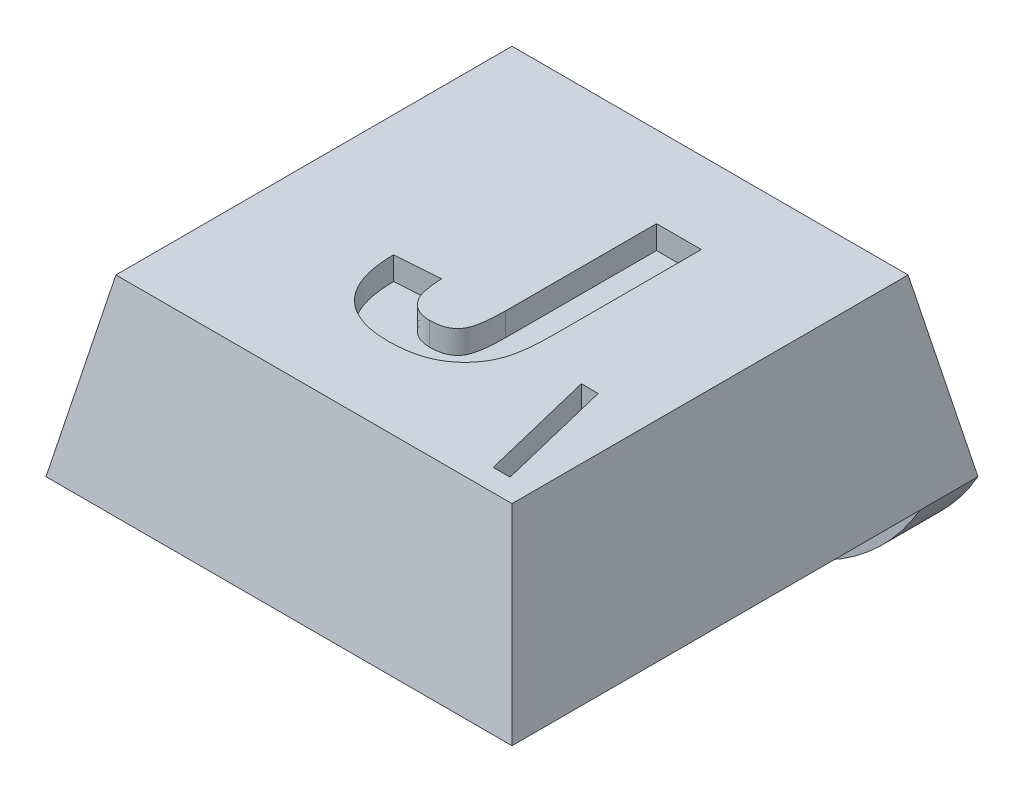
ISO-10303-21;
HEADER;
FILE_DESCRIPTION(('STEP AP214'),'2;1');
FILE_NAME('part.step','',(''),(''),'','','');
FILE_SCHEMA(('AUTOMOTIVE_DESIGN { 1 0 10303 214 1 1 1 1 }'));
ENDSEC;
DATA;
#1=APPLICATION_CONTEXT('core data for automotive mechanical design processes');
#2=APPLICATION_PROTOCOL_DEFINITION('international standard','automotive_design',2000,#1);
#3=PRODUCT_CONTEXT('',#1,'mechanical');
#4=PRODUCT('Part','Part','',(#3));
#5=PRODUCT_RELATED_PRODUCT_CATEGORY('part','',(#4));
#6=PRODUCT_DEFINITION_FORMATION('','',#4);
#7=PRODUCT_DEFINITION_CONTEXT('part definition',#1,'design');
#8=PRODUCT_DEFINITION('design','',#6,#7);
#9=PRODUCT_DEFINITION_SHAPE('','',#8);
#10=(LENGTH_UNIT() NAMED_UNIT(*) SI_UNIT(.MILLI.,.METRE.));
#11=(NAMED_UNIT(*) PLANE_ANGLE_UNIT() SI_UNIT($,.RADIAN.));
#12=(NAMED_UNIT(*) SI_UNIT($,.STERADIAN.) SOLID_ANGLE_UNIT());
#13=UNCERTAINTY_MEASURE_WITH_UNIT(LENGTH_MEASURE(1.E-05),#10,'distance_accuracy_value','');
#14=(GEOMETRIC_REPRESENTATION_CONTEXT(3) GLOBAL_UNCERTAINTY_ASSIGNED_CONTEXT((#13)) GLOBAL_UNIT_ASSIGNED_CONTEXT((#10,
#11,#12)) REPRESENTATION_CONTEXT('',''));
#15=CARTESIAN_POINT('',(0.,0.,0.));
#16=DIRECTION('',(0.,0.,1.));
#17=DIRECTION('',(1.,0.,0.));
#18=AXIS2_PLACEMENT_3D('',#15,#16,#17);
#19=CARTESIAN_POINT('',(0.,3.,0.));
#20=DIRECTION('',(0.,-1.,0.));
#21=DIRECTION('',(0.,0.,-1.));
#22=AXIS2_PLACEMENT_3D('',#19,#20,#21);
#23=PLANE('',#22);
#24=DIRECTION('',(0.,0.,-1.));
#25=VECTOR('',#24,1.);
#26=CARTESIAN_POINT('',(4.47863523599211,3.,-3.41391404386237));
#27=LINE('',#26,#25);
#28=CARTESIAN_POINT('',(4.47863523599211,3.,-3.41391404386237));
#29=VERTEX_POINT('',#28);
#30=CARTESIAN_POINT('',(4.47863523599211,3.,-6.00285635155468));
#31=VERTEX_POINT('',#30);
#32=EDGE_CURVE('E66',#29,#31,#27,.T.);
#33=ORIENTED_EDGE('',*,*,#32,.T.);
#34=DIRECTION('',(1.,0.,0.));
#35=VECTOR('',#34,1.);
#36=CARTESIAN_POINT('',(4.47863523599211,3.,-6.00285635155468));
#37=LINE('',#36,#35);
#38=CARTESIAN_POINT('',(5.24786600522288,3.,-6.00285635155468));
#39=VERTEX_POINT('',#38);
#40=EDGE_CURVE('E214',#31,#39,#37,.T.);
#41=ORIENTED_EDGE('',*,*,#40,.T.);
#42=DIRECTION('',(0.,0.,1.));
#43=VECTOR('',#42,1.);
#44=CARTESIAN_POINT('',(5.24786600522288,3.,-6.00285635155468));
#45=LINE('',#44,#43);
#46=CARTESIAN_POINT('',(5.24786600522288,3.,-3.48122173617007));
#47=VERTEX_POINT('',#46);
#48=EDGE_CURVE('E502',#39,#47,#45,.T.);
#49=ORIENTED_EDGE('',*,*,#48,.T.);
#50=CARTESIAN_POINT('',(5.24786600522288,3.,-3.48122173617007));
#51=CARTESIAN_POINT('',(5.24752225511572,3.,-3.44115386886636));
#52=CARTESIAN_POINT('',(5.2468552055461,3.,-3.36340188251499));
#53=CARTESIAN_POINT('',(5.24275650156162,3.,-3.25039046502719));
#54=CARTESIAN_POINT('',(5.23665832133049,3.,-3.14454193046868));
#55=CARTESIAN_POINT('',(5.22727722213507,3.,-3.04587147100803));
#56=CARTESIAN_POINT('',(5.21405872026987,3.,-2.95459238833429));
#57=CARTESIAN_POINT('',(5.20004986677814,3.,-2.86997657489744));
#58=CARTESIAN_POINT('',(5.18304142709716,3.,-2.79245169237198));
#59=CARTESIAN_POINT('',(5.16780003561618,3.,-2.74395130585806));
#60=CARTESIAN_POINT('',(5.16052626163313,3.,-2.7208050695034));
#61=B_SPLINE_CURVE_WITH_KNOTS('',3,(#50,#51,#52,#53,#54,#55,#56,#57,#58,#59,#60),.UNSPECIFIED.,
.F.,.F.,(4,1,1,1,1,1,1,1,4),(0.,0.156452495119165,0.303597198546586,0.441515756123935,
0.57040444623701,0.690463066411908,0.801567510862614,0.905300439354285,1.),.UNSPECIFIED.);
#62=CARTESIAN_POINT('',(5.16052626163313,3.,-2.7208050695034));
#63=VERTEX_POINT('',#62);
#64=EDGE_CURVE('E506',#47,#63,#61,.T.);
#65=ORIENTED_EDGE('',*,*,#64,.T.);
#66=CARTESIAN_POINT('',(5.16052626163313,3.,-2.7208050695034));
#67=CARTESIAN_POINT('',(5.15036108111888,3.,-2.69228260075384));
#68=CARTESIAN_POINT('',(5.13024360189988,3.,-2.63583498808826));
#69=CARTESIAN_POINT('',(5.09114165266873,3.,-2.55531488098573));
#70=CARTESIAN_POINT('',(5.04617643068522,3.,-2.47908431540956));
#71=CARTESIAN_POINT('',(4.9954744836834,3.,-2.40681293841355));
#72=CARTESIAN_POINT('',(4.93951471700895,3.,-2.3382109873061));
#73=CARTESIAN_POINT('',(4.87639907650832,3.,-2.27508664932136));
#74=CARTESIAN_POINT('',(4.80834779956692,3.,-2.21523809822528));
#75=CARTESIAN_POINT('',(4.73344668122952,3.,-2.16114528886516));
#76=CARTESIAN_POINT('',(4.65358079146145,3.,-2.11070979383156));
#77=CARTESIAN_POINT('',(4.56647505050752,3.,-2.06868896260535));
#78=CARTESIAN_POINT('',(4.47384329891444,3.,-2.03234038710198));
#79=CARTESIAN_POINT('',(4.37490810397317,3.,-2.00281662788184));
#80=CARTESIAN_POINT('',(4.26964077765763,3.,-1.97971607285242));
#81=CARTESIAN_POINT('',(4.15831100110899,3.,-1.96290189406509));
#82=CARTESIAN_POINT('',(4.04077046567442,3.,-1.95334773003709));
#83=CARTESIAN_POINT('',(3.96049016407211,3.,-1.95217527382871));
#84=CARTESIAN_POINT('',(3.91934036419724,3.,-1.95157430027263));
#85=B_SPLINE_CURVE_WITH_KNOTS('',3,(#66,#67,#68,#69,#70,#71,#72,#73,#74,#75,#76,#77,#78,#79,#80,
#81,#82,#83,#84),.UNSPECIFIED.,.F.,.F.,(4,1,1,1,1,1,1,1,1,1,1,1,1,1,1,1,4),(0.,
0.0578458170130587,0.114480212135457,0.170784536242213,0.226875480201814,0.283096404177707,
0.339779109412981,0.397319931612097,0.456142184292489,0.516216371074673,0.577640129433395,
0.640691136416188,0.706271339139874,0.77477558408517,0.846550476911842,0.921345373149547,1.),.UNSPECIFIED.);
#86=CARTESIAN_POINT('',(3.91934036419724,3.,-1.95157430027263));
#87=VERTEX_POINT('',#86);
#88=EDGE_CURVE('E512',#63,#87,#85,.T.);
#89=ORIENTED_EDGE('',*,*,#88,.T.);
#90=CARTESIAN_POINT('',(3.91934036419724,3.,-1.95157430027263));
#91=CARTESIAN_POINT('',(3.87122552775589,3.,-1.95273721135087));
#92=CARTESIAN_POINT('',(3.77768594443229,3.,-1.95499801541353));
#93=CARTESIAN_POINT('',(3.64166147511049,3.,-1.9700076897214));
#94=CARTESIAN_POINT('',(3.51410056447315,3.,-1.99626024238106));
#95=CARTESIAN_POINT('',(3.39538704832291,3.,-2.03417967545256));
#96=CARTESIAN_POINT('',(3.28430787386042,3.,-2.08131717039047));
#97=CARTESIAN_POINT('',(3.18220656089415,3.,-2.14011472571528));
#98=CARTESIAN_POINT('',(3.08854047676782,3.,-2.20939270114689));
#99=CARTESIAN_POINT('',(3.00391871149983,3.,-2.28936343112476));
#100=CARTESIAN_POINT('',(2.92829943263745,3.,-2.37921821520504));
#101=CARTESIAN_POINT('',(2.86302647475674,3.,-2.47974541520825));
#102=CARTESIAN_POINT('',(2.80762711961946,3.,-2.5898937430363));
#103=CARTESIAN_POINT('',(2.76298469212978,3.,-2.71016150555024));
#104=CARTESIAN_POINT('',(2.72773939671791,3.,-2.8399729134613));
#105=CARTESIAN_POINT('',(2.7023174618641,3.,-2.97960128819225));
#106=CARTESIAN_POINT('',(2.68714789434325,3.,-3.12912613406769));
#107=CARTESIAN_POINT('',(2.68491317155468,3.,-3.23198720027981));
#108=CARTESIAN_POINT('',(2.68376344112031,3.,-3.28490763360596));
#109=B_SPLINE_CURVE_WITH_KNOTS('',3,(#90,#91,#92,#93,#94,#95,#96,#97,#98,#99,#100,#101,#102,
#103,#104,#105,#106,#107,#108),.UNSPECIFIED.,.F.,.F.,(4,1,1,1,1,1,1,1,1,1,1,1,1,1,1,1,4),(0.,
0.0696292858637476,0.135365614195809,0.197756356389333,0.257779246829448,0.315436810851021,
0.372058901761518,0.427875728209648,0.483657745283362,0.540176831628515,0.597427412819986,
0.65672025189341,0.718247696480561,0.782762362646519,0.851147772011753,0.923417822731319,1.),.UNSPECIFIED.);
#110=CARTESIAN_POINT('',(2.68376344112031,3.,-3.28490763360596));
#111=VERTEX_POINT('',#110);
#112=EDGE_CURVE('E521',#87,#111,#109,.T.);
#113=ORIENTED_EDGE('',*,*,#112,.T.);
#114=DIRECTION('',(0.997785157856609,0.,-0.0665190105237744));
#115=VECTOR('',#114,1.);
#116=CARTESIAN_POINT('',(2.68376344112031,3.,-3.28490763360596));
#117=LINE('',#116,#115);
#118=CARTESIAN_POINT('',(3.45299421035108,3.,-3.33618968488802));
#119=VERTEX_POINT('',#118);
#120=EDGE_CURVE('E530',#111,#119,#117,.T.);
#121=ORIENTED_EDGE('',*,*,#120,.T.);
#122=CARTESIAN_POINT('',(3.45299421035108,3.,-3.33618968488802));
#123=CARTESIAN_POINT('',(3.45437576720145,3.,-3.30786259790295));
#124=CARTESIAN_POINT('',(3.45702497993634,3.,-3.25354382009574));
#125=CARTESIAN_POINT('',(3.46438093481815,3.,-3.17524086648235));
#126=CARTESIAN_POINT('',(3.47368268694616,3.,-3.10327127682234));
#127=CARTESIAN_POINT('',(3.48585383717944,3.,-3.03785106374312));
#128=CARTESIAN_POINT('',(3.49896082283715,3.,-2.97842744402968));
#129=CARTESIAN_POINT('',(3.51598700225223,3.,-2.9261698568959));
#130=CARTESIAN_POINT('',(3.53388655569812,3.,-2.87924076853295));
#131=CARTESIAN_POINT('',(3.54960838745535,3.,-2.85178351122112));
#132=CARTESIAN_POINT('',(3.55716087701775,3.,-2.83859353104186));
#133=B_SPLINE_CURVE_WITH_KNOTS('',3,(#122,#123,#124,#125,#126,#127,#128,#129,#130,#131,#132),
.UNSPECIFIED.,.F.,.F.,(4,1,1,1,1,1,1,1,4),(0.,0.165826153270336,0.317980948018504,
0.459795738565099,0.589996550393839,0.707065953418222,0.815243566739462,0.911246281264675,1.),.UNSPECIFIED.);
#134=CARTESIAN_POINT('',(3.55716087701775,3.,-2.83859353104186));
#135=VERTEX_POINT('',#134);
#136=EDGE_CURVE('E537',#119,#135,#133,.T.);
#137=ORIENTED_EDGE('',*,*,#136,.T.);
#138=CARTESIAN_POINT('',(3.55716087701775,3.,-2.83859353104186));
#139=CARTESIAN_POINT('',(3.56872297026109,3.,-2.82114812140039));
#140=CARTESIAN_POINT('',(3.5914786098731,3.,-2.78681338232417));
#141=CARTESIAN_POINT('',(3.63299092938756,3.,-2.74207160503994));
#142=CARTESIAN_POINT('',(3.67755853703033,3.,-2.70295584275881));
#143=CARTESIAN_POINT('',(3.7276195539163,3.,-2.67220300867414));
#144=CARTESIAN_POINT('',(3.78178052727939,3.,-2.64801682943951));
#145=CARTESIAN_POINT('',(3.84044803681409,3.,-2.63044224953724));
#146=CARTESIAN_POINT('',(3.90346033058215,3.,-2.61978585285303));
#147=CARTESIAN_POINT('',(3.94680846284558,3.,-2.61876437011324));
#148=CARTESIAN_POINT('',(3.96901985137672,3.,-2.6182409669393));
#149=B_SPLINE_CURVE_WITH_KNOTS('',3,(#138,#139,#140,#141,#142,#143,#144,#145,#146,#147,#148),
.UNSPECIFIED.,.F.,.F.,(4,1,1,1,1,1,1,1,4),(0.,0.127957288456737,0.251835881320901,
0.372465314870914,0.490006212112382,0.610068863669226,0.734765287953249,0.864094923273421,1.),.UNSPECIFIED.);
#150=CARTESIAN_POINT('',(3.96901985137672,3.,-2.6182409669393));
#151=VERTEX_POINT('',#150);
#152=EDGE_CURVE('E543',#135,#151,#149,.T.);
#153=ORIENTED_EDGE('',*,*,#152,.T.);
#154=CARTESIAN_POINT('',(3.96901985137672,3.,-2.6182409669393));
#155=CARTESIAN_POINT('',(3.99147724775292,3.,-2.61865945316102));
#156=CARTESIAN_POINT('',(4.03464752738319,3.,-2.61946391717416));
#157=CARTESIAN_POINT('',(4.09686091011261,3.,-2.62677921913698));
#158=CARTESIAN_POINT('',(4.15406303340528,3.,-2.63863282439469));
#159=CARTESIAN_POINT('',(4.20628505369981,3.,-2.65529485624049));
#160=CARTESIAN_POINT('',(4.25370386751579,3.,-2.6769246227107));
#161=CARTESIAN_POINT('',(4.29526839276369,3.,-2.7045961658879));
#162=CARTESIAN_POINT('',(4.33276968959403,3.,-2.73573291501313));
#163=CARTESIAN_POINT('',(4.3651648902046,3.,-2.77318826399133));
#164=CARTESIAN_POINT('',(4.3927662355869,3.,-2.81831895728671));
#165=CARTESIAN_POINT('',(4.41581210499667,3.,-2.87324896159926));
#166=CARTESIAN_POINT('',(4.43563784023723,3.,-2.93820422141634));
#167=CARTESIAN_POINT('',(4.45096017752995,3.,-3.01367854972563));
#168=CARTESIAN_POINT('',(4.46400250876483,3.,-3.09894939887271));
#169=CARTESIAN_POINT('',(4.47218369239211,3.,-3.19477071558805));
#170=CARTESIAN_POINT('',(4.4780643862916,3.,-3.30085929507591));
#171=CARTESIAN_POINT('',(4.47843963391815,3.,-3.375175750204));
#172=CARTESIAN_POINT('',(4.47863523599211,3.,-3.41391404386237));
#173=B_SPLINE_CURVE_WITH_KNOTS('',3,(#154,#155,#156,#157,#158,#159,#160,#161,#162,#163,#164,
#165,#166,#167,#168,#169,#170,#171,#172),.UNSPECIFIED.,.F.,.F.,(4,1,1,1,1,1,1,1,1,1,1,1,1,1,1,1,
4),(0.,0.0612696766946458,0.117779863322363,0.170676728222519,0.220468992129151,
0.267103819976365,0.312391821648745,0.356352173127523,0.399759083159082,0.446892572188991,
0.500109905692333,0.561902028042048,0.631955790870925,0.7100982931769,0.797211503732284,
0.894294200316469,1.),.UNSPECIFIED.);
#174=EDGE_CURVE('E225',#151,#29,#173,.T.);
#175=ORIENTED_EDGE('',*,*,#174,.T.);
#176=EDGE_LOOP('',(#33,#41,#49,#65,#89,#113,#121,#137,#153,#175));
#177=FACE_BOUND('',#176,.T.);
#178=DIRECTION('',(-1.,0.,0.));
#179=VECTOR('',#178,1.);
#180=CARTESIAN_POINT('',(11.,3.,-0.6));
#181=LINE('',#180,#179);
#182=CARTESIAN_POINT('',(7.4,3.,-0.6));
#183=VERTEX_POINT('',#182);
#184=CARTESIAN_POINT('',(0.6,3.,-0.6));
#185=VERTEX_POINT('',#184);
#186=EDGE_CURVE('E354',#183,#185,#181,.T.);
#187=ORIENTED_EDGE('',*,*,#186,.F.);
#188=DIRECTION('',(0.,0.,1.));
#189=VECTOR('',#188,1.);
#190=CARTESIAN_POINT('',(7.4,3.,-8.));
#191=LINE('',#190,#189);
#192=CARTESIAN_POINT('',(7.4,3.,-7.4));
#193=VERTEX_POINT('',#192);
#194=EDGE_CURVE('E367',#193,#183,#191,.T.);
#195=ORIENTED_EDGE('',*,*,#194,.F.);
#196=DIRECTION('',(-1.,0.,0.));
#197=VECTOR('',#196,1.);
#198=CARTESIAN_POINT('',(11.,3.,-7.4));
#199=LINE('',#198,#197);
#200=CARTESIAN_POINT('',(0.599999999999999,3.,-7.4));
#201=VERTEX_POINT('',#200);
#202=EDGE_CURVE('E350',#193,#201,#199,.T.);
#203=ORIENTED_EDGE('',*,*,#202,.T.);
#204=DIRECTION('',(0.,0.,1.));
#205=VECTOR('',#204,1.);
#206=CARTESIAN_POINT('',(0.6,3.,-8.));
#207=LINE('',#206,#205);
#208=EDGE_CURVE('E370',#201,#185,#207,.T.);
#209=ORIENTED_EDGE('',*,*,#208,.T.);
#210=EDGE_LOOP('',(#187,#195,#203,#209));
#211=FACE_BOUND('',#210,.T.);
#212=DIRECTION('',(-0.23685313162707,0.,-0.9715454667891));
#213=VECTOR('',#212,1.);
#214=CARTESIAN_POINT('',(6.70029877777824,3.,-0.97731022127194));
#215=LINE('',#214,#213);
#216=CARTESIAN_POINT('',(6.70029877777824,3.,-0.97731022127194));
#217=VERTEX_POINT('',#216);
#218=CARTESIAN_POINT('',(6.21271864957311,3.,-2.97731022127194));
#219=VERTEX_POINT('',#218);
#220=EDGE_CURVE('E58',#217,#219,#215,.T.);
#221=ORIENTED_EDGE('',*,*,#220,.T.);
#222=DIRECTION('',(1.,0.,0.));
#223=VECTOR('',#222,1.);
#224=CARTESIAN_POINT('',(6.21271864957311,3.,-2.97731022127194));
#225=LINE('',#224,#223);
#226=CARTESIAN_POINT('',(6.50278275213721,3.,-2.97731022127194));
#227=VERTEX_POINT('',#226);
#228=EDGE_CURVE('E208',#219,#227,#225,.T.);
#229=ORIENTED_EDGE('',*,*,#228,.T.);
#230=DIRECTION('',(0.23666941653505,0.,0.971590236301785));
#231=VECTOR('',#230,1.);
#232=CARTESIAN_POINT('',(6.50278275213721,3.,-2.97731022127194));
#233=LINE('',#232,#231);
#234=CARTESIAN_POINT('',(6.9899622393167,3.,-0.97731022127194));
#235=VERTEX_POINT('',#234);
#236=EDGE_CURVE('E439',#227,#235,#233,.T.);
#237=ORIENTED_EDGE('',*,*,#236,.T.);
#238=DIRECTION('',(-1.,0.,0.));
#239=VECTOR('',#238,1.);
#240=CARTESIAN_POINT('',(6.9899622393167,3.,-0.97731022127194));
#241=LINE('',#240,#239);
#242=EDGE_CURVE('E204',#235,#217,#241,.T.);
#243=ORIENTED_EDGE('',*,*,#242,.T.);
#244=EDGE_LOOP('',(#221,#229,#237,#243));
#245=FACE_BOUND('',#244,.T.);
#246=ADVANCED_FACE('F42',(#177,#211,#245),#23,.F.);
#247=CARTESIAN_POINT('',(8.,0.,-8.));
#248=DIRECTION('',(-0.98058067569092,-0.196116135138184,0.));
#249=DIRECTION('',(0.196116135138184,-0.98058067569092,0.));
#250=AXIS2_PLACEMENT_3D('',#247,#248,#249);
#251=PLANE('',#250);
#252=DIRECTION('',(-0.192450089729875,0.962250448649376,-0.192450089729875));
#253=VECTOR('',#252,1.);
#254=CARTESIAN_POINT('',(7.7037037037037,1.48148148148148,-0.296296296296296));
#255=LINE('',#254,#253);
#256=CARTESIAN_POINT('',(8.,0.,0.));
#257=VERTEX_POINT('',#256);
#258=EDGE_CURVE('E364',#257,#183,#255,.T.);
#259=ORIENTED_EDGE('',*,*,#258,.F.);
#260=DIRECTION('',(0.,0.,-1.));
#261=VECTOR('',#260,1.);
#262=CARTESIAN_POINT('',(8.,0.,0.));
#263=LINE('',#262,#261);
#264=CARTESIAN_POINT('',(8.,0.,-7.));
#265=VERTEX_POINT('',#264);
#266=EDGE_CURVE('E381',#257,#265,#263,.T.);
#267=ORIENTED_EDGE('',*,*,#266,.T.);
#268=DIRECTION('',(0.,0.,1.));
#269=VECTOR('',#268,1.);
#270=CARTESIAN_POINT('',(8.,0.,-8.));
#271=LINE('',#270,#269);
#272=CARTESIAN_POINT('',(8.,0.,-8.));
#273=VERTEX_POINT('',#272);
#274=EDGE_CURVE('E316',#273,#265,#271,.T.);
#275=ORIENTED_EDGE('',*,*,#274,.F.);
#276=DIRECTION('',(0.192450089729875,-0.962250448649376,-0.192450089729875));
#277=VECTOR('',#276,1.);
#278=CARTESIAN_POINT('',(8.,0.,-8.));
#279=LINE('',#278,#277);
#280=EDGE_CURVE('E357',#193,#273,#279,.T.);
#281=ORIENTED_EDGE('',*,*,#280,.F.);
#282=ORIENTED_EDGE('',*,*,#194,.T.);
#283=EDGE_LOOP('',(#259,#267,#275,#281,#282));
#284=FACE_BOUND('',#283,.T.);
#285=ADVANCED_FACE('F297',(#284),#251,.F.);
#286=CARTESIAN_POINT('',(0.,0.,-8.));
#287=DIRECTION('',(0.98058067569092,-0.196116135138184,0.));
#288=DIRECTION('',(0.196116135138184,0.98058067569092,0.));
#289=AXIS2_PLACEMENT_3D('',#286,#287,#288);
#290=PLANE('',#289);
#291=DIRECTION('',(-0.192450089729875,-0.962250448649376,0.192450089729875));
#292=VECTOR('',#291,1.);
#293=CARTESIAN_POINT('',(0.296296296296296,1.48148148148148,-0.296296296296296));
#294=LINE('',#293,#292);
#295=CARTESIAN_POINT('',(0.,0.,0.));
#296=VERTEX_POINT('',#295);
#297=EDGE_CURVE('E406',#185,#296,#294,.T.);
#298=ORIENTED_EDGE('',*,*,#297,.F.);
#299=ORIENTED_EDGE('',*,*,#208,.F.);
#300=DIRECTION('',(0.192450089729875,0.962250448649376,0.192450089729875));
#301=VECTOR('',#300,1.);
#302=CARTESIAN_POINT('',(0.,0.,-8.));
#303=LINE('',#302,#301);
#304=CARTESIAN_POINT('',(0.,0.,-8.));
#305=VERTEX_POINT('',#304);
#306=EDGE_CURVE('E380',#305,#201,#303,.T.);
#307=ORIENTED_EDGE('',*,*,#306,.F.);
#308=DIRECTION('',(0.,0.,1.));
#309=VECTOR('',#308,1.);
#310=CARTESIAN_POINT('',(0.,0.,0.));
#311=LINE('',#310,#309);
#312=CARTESIAN_POINT('',(0.,0.,-7.));
#313=VERTEX_POINT('',#312);
#314=EDGE_CURVE('E385',#305,#313,#311,.T.);
#315=ORIENTED_EDGE('',*,*,#314,.T.);
#316=EDGE_CURVE('E374',#313,#296,#311,.T.);
#317=ORIENTED_EDGE('',*,*,#316,.T.);
#318=EDGE_LOOP('',(#298,#299,#307,#315,#317));
#319=FACE_BOUND('',#318,.T.);
#320=ADVANCED_FACE('F294',(#319),#290,.F.);
#321=CARTESIAN_POINT('',(0.,0.,0.));
#322=DIRECTION('',(0.,-1.,0.));
#323=DIRECTION('',(0.,0.,-1.));
#324=AXIS2_PLACEMENT_3D('',#321,#322,#323);
#325=PLANE('',#324);
#326=DIRECTION('',(-1.,0.,0.));
#327=VECTOR('',#326,1.);
#328=CARTESIAN_POINT('',(0.,0.,-7.));
#329=LINE('',#328,#327);
#330=EDGE_CURVE('E332',#265,#313,#329,.T.);
#331=ORIENTED_EDGE('',*,*,#330,.F.);
#332=ORIENTED_EDGE('',*,*,#266,.F.);
#333=DIRECTION('',(1.,0.,0.));
#334=VECTOR('',#333,1.);
#335=CARTESIAN_POINT('',(0.,0.,0.));
#336=LINE('',#335,#334);
#337=EDGE_CURVE('E382',#296,#257,#336,.T.);
#338=ORIENTED_EDGE('',*,*,#337,.F.);
#339=ORIENTED_EDGE('',*,*,#316,.F.);
#340=EDGE_LOOP('',(#331,#332,#338,#339));
#341=FACE_BOUND('',#340,.T.);
#342=CARTESIAN_POINT('',(4.,0.,-3.75));
#343=DIRECTION('',(0.,-1.,0.));
#344=DIRECTION('',(0.,0.,-1.));
#345=AXIS2_PLACEMENT_3D('',#342,#343,#344);
#346=CIRCLE('',#345,1.8);
#347=CARTESIAN_POINT('',(4.,0.,-5.55));
#348=VERTEX_POINT('',#347);
#349=EDGE_CURVE('E336',#348,#348,#346,.T.);
#350=ORIENTED_EDGE('',*,*,#349,.F.);
#351=EDGE_LOOP('',(#350));
#352=FACE_BOUND('',#351,.T.);
#353=ADVANCED_FACE('F292',(#341,#352),#325,.T.);
#354=CARTESIAN_POINT('',(11.,3.,-7.4));
#355=DIRECTION('',(0.,0.196116135138184,-0.98058067569092));
#356=DIRECTION('',(0.,0.98058067569092,0.196116135138184));
#357=AXIS2_PLACEMENT_3D('',#354,#355,#356);
#358=PLANE('',#357);
#359=ORIENTED_EDGE('',*,*,#280,.T.);
#360=DIRECTION('',(-1.,0.,0.));
#361=VECTOR('',#360,1.);
#362=CARTESIAN_POINT('',(0.,0.,-8.));
#363=LINE('',#362,#361);
#364=EDGE_CURVE('E324',#273,#305,#363,.T.);
#365=ORIENTED_EDGE('',*,*,#364,.T.);
#366=ORIENTED_EDGE('',*,*,#306,.T.);
#367=ORIENTED_EDGE('',*,*,#202,.F.);
#368=EDGE_LOOP('',(#359,#365,#366,#367));
#369=FACE_BOUND('',#368,.T.);
#370=ADVANCED_FACE('F288',(#369),#358,.T.);
#371=CARTESIAN_POINT('',(11.,0.,0.));
#372=DIRECTION('',(0.,0.196116135138184,0.98058067569092));
#373=DIRECTION('',(0.,-0.98058067569092,0.196116135138184));
#374=AXIS2_PLACEMENT_3D('',#371,#372,#373);
#375=PLANE('',#374);
#376=ORIENTED_EDGE('',*,*,#258,.T.);
#377=ORIENTED_EDGE('',*,*,#186,.T.);
#378=ORIENTED_EDGE('',*,*,#297,.T.);
#379=ORIENTED_EDGE('',*,*,#337,.T.);
#380=EDGE_LOOP('',(#376,#377,#378,#379));
#381=FACE_BOUND('',#380,.T.);
#382=ADVANCED_FACE('F284',(#381),#375,.T.);
#383=CARTESIAN_POINT('',(4.,0.8,-3.75));
#384=DIRECTION('',(0.,-1.,0.));
#385=DIRECTION('',(0.,0.,-1.));
#386=AXIS2_PLACEMENT_3D('',#383,#384,#385);
#387=CYLINDRICAL_SURFACE('',#386,1.8);
#388=CARTESIAN_POINT('',(4.,0.8,-3.75));
#389=DIRECTION('',(0.,-1.,0.));
#390=DIRECTION('',(0.,0.,-1.));
#391=AXIS2_PLACEMENT_3D('',#388,#389,#390);
#392=CIRCLE('',#391,1.8);
#393=CARTESIAN_POINT('',(4.,0.8,-5.55));
#394=VERTEX_POINT('',#393);
#395=EDGE_CURVE('E346',#394,#394,#392,.T.);
#396=ORIENTED_EDGE('',*,*,#395,.F.);
#397=EDGE_LOOP('',(#396));
#398=FACE_BOUND('',#397,.T.);
#399=ORIENTED_EDGE('',*,*,#349,.T.);
#400=EDGE_LOOP('',(#399));
#401=FACE_BOUND('',#400,.T.);
#402=ADVANCED_FACE('F280',(#398,#401),#387,.F.);
#403=CARTESIAN_POINT('',(4.,0.8,-3.75));
#404=DIRECTION('',(0.,-1.,0.));
#405=DIRECTION('',(0.,0.,-1.));
#406=AXIS2_PLACEMENT_3D('',#403,#404,#405);
#407=PLANE('',#406);
#408=ORIENTED_EDGE('',*,*,#395,.T.);
#409=EDGE_LOOP('',(#408));
#410=FACE_BOUND('',#409,.T.);
#411=ADVANCED_FACE('F276',(#410),#407,.T.);
#412=CARTESIAN_POINT('',(0.,-2.,-8.));
#413=DIRECTION('',(0.,0.,1.));
#414=DIRECTION('',(1.,0.,0.));
#415=AXIS2_PLACEMENT_3D('',#412,#413,#414);
#416=PLANE('',#415);
#417=ORIENTED_EDGE('',*,*,#364,.F.);
#418=CARTESIAN_POINT('',(4.53589838486225,2.,-8.));
#419=DIRECTION('',(0.,0.,1.));
#420=DIRECTION('',(1.,0.,0.));
#421=AXIS2_PLACEMENT_3D('',#418,#419,#420);
#422=CIRCLE('',#421,4.);
#423=CARTESIAN_POINT('',(4.53589838486225,-2.,-8.));
#424=VERTEX_POINT('',#423);
#425=EDGE_CURVE('E11',#273,#424,#422,.F.);
#426=ORIENTED_EDGE('',*,*,#425,.T.);
#427=DIRECTION('',(1.,0.,0.));
#428=VECTOR('',#427,1.);
#429=CARTESIAN_POINT('',(0.,-2.,-8.));
#430=LINE('',#429,#428);
#431=CARTESIAN_POINT('',(3.46410161513775,-2.,-8.));
#432=VERTEX_POINT('',#431);
#433=EDGE_CURVE('E322',#432,#424,#430,.T.);
#434=ORIENTED_EDGE('',*,*,#433,.F.);
#435=CARTESIAN_POINT('',(3.46410161513775,2.,-8.));
#436=DIRECTION('',(0.,0.,1.));
#437=DIRECTION('',(1.,0.,0.));
#438=AXIS2_PLACEMENT_3D('',#435,#436,#437);
#439=CIRCLE('',#438,4.);
#440=EDGE_CURVE('E51',#432,#305,#439,.F.);
#441=ORIENTED_EDGE('',*,*,#440,.T.);
#442=EDGE_LOOP('',(#417,#426,#434,#441));
#443=FACE_BOUND('',#442,.T.);
#444=ADVANCED_FACE('F272',(#443),#416,.F.);
#445=CARTESIAN_POINT('',(0.,-2.,-7.));
#446=DIRECTION('',(0.,0.,-1.));
#447=DIRECTION('',(-1.,0.,0.));
#448=AXIS2_PLACEMENT_3D('',#445,#446,#447);
#449=PLANE('',#448);
#450=DIRECTION('',(-1.,0.,0.));
#451=VECTOR('',#450,1.);
#452=CARTESIAN_POINT('',(0.,-2.,-7.));
#453=LINE('',#452,#451);
#454=CARTESIAN_POINT('',(4.53589838486225,-2.,-7.));
#455=VERTEX_POINT('',#454);
#456=CARTESIAN_POINT('',(3.46410161513775,-2.,-7.));
#457=VERTEX_POINT('',#456);
#458=EDGE_CURVE('E331',#455,#457,#453,.T.);
#459=ORIENTED_EDGE('',*,*,#458,.F.);
#460=CARTESIAN_POINT('',(4.53589838486225,2.,-7.));
#461=DIRECTION('',(0.,0.,-1.));
#462=DIRECTION('',(-1.,0.,0.));
#463=AXIS2_PLACEMENT_3D('',#460,#461,#462);
#464=CIRCLE('',#463,4.);
#465=EDGE_CURVE('E412',#455,#265,#464,.F.);
#466=ORIENTED_EDGE('',*,*,#465,.T.);
#467=ORIENTED_EDGE('',*,*,#330,.T.);
#468=CARTESIAN_POINT('',(3.46410161513775,2.,-7.));
#469=DIRECTION('',(0.,0.,-1.));
#470=DIRECTION('',(-1.,0.,0.));
#471=AXIS2_PLACEMENT_3D('',#468,#469,#470);
#472=CIRCLE('',#471,4.);
#473=EDGE_CURVE('E409',#313,#457,#472,.F.);
#474=ORIENTED_EDGE('',*,*,#473,.T.);
#475=EDGE_LOOP('',(#459,#466,#467,#474));
#476=FACE_BOUND('',#475,.T.);
#477=ADVANCED_FACE('F268',(#476),#449,.F.);
#478=CARTESIAN_POINT('',(0.,-2.,0.));
#479=DIRECTION('',(0.,1.,0.));
#480=DIRECTION('',(0.,0.,1.));
#481=AXIS2_PLACEMENT_3D('',#478,#479,#480);
#482=PLANE('',#481);
#483=ORIENTED_EDGE('',*,*,#433,.T.);
#484=DIRECTION('',(0.,0.,1.));
#485=VECTOR('',#484,1.);
#486=CARTESIAN_POINT('',(4.53589838486225,-2.,0.));
#487=LINE('',#486,#485);
#488=EDGE_CURVE('E318',#424,#455,#487,.T.);
#489=ORIENTED_EDGE('',*,*,#488,.T.);
#490=ORIENTED_EDGE('',*,*,#458,.T.);
#491=DIRECTION('',(0.,0.,-1.));
#492=VECTOR('',#491,1.);
#493=CARTESIAN_POINT('',(3.46410161513775,-2.,0.));
#494=LINE('',#493,#492);
#495=EDGE_CURVE('E329',#457,#432,#494,.T.);
#496=ORIENTED_EDGE('',*,*,#495,.T.);
#497=EDGE_LOOP('',(#483,#489,#490,#496));
#498=FACE_BOUND('',#497,.T.);
#499=ADVANCED_FACE('F264',(#498),#482,.F.);
#500=CARTESIAN_POINT('',(4.53589838486225,2.,-8.));
#501=DIRECTION('',(0.,0.,1.));
#502=DIRECTION('',(1.,0.,0.));
#503=AXIS2_PLACEMENT_3D('',#500,#501,#502);
#504=CYLINDRICAL_SURFACE('',#503,4.);
#505=ORIENTED_EDGE('',*,*,#425,.F.);
#506=ORIENTED_EDGE('',*,*,#274,.T.);
#507=ORIENTED_EDGE('',*,*,#465,.F.);
#508=ORIENTED_EDGE('',*,*,#488,.F.);
#509=EDGE_LOOP('',(#505,#506,#507,#508));
#510=FACE_BOUND('',#509,.T.);
#511=ADVANCED_FACE('F267',(#510),#504,.T.);
#512=CARTESIAN_POINT('',(3.46410161513775,2.,-8.));
#513=DIRECTION('',(0.,0.,-1.));
#514=DIRECTION('',(-1.,0.,0.));
#515=AXIS2_PLACEMENT_3D('',#512,#513,#514);
#516=CYLINDRICAL_SURFACE('',#515,4.);
#517=ORIENTED_EDGE('',*,*,#473,.F.);
#518=ORIENTED_EDGE('',*,*,#314,.F.);
#519=ORIENTED_EDGE('',*,*,#440,.F.);
#520=ORIENTED_EDGE('',*,*,#495,.F.);
#521=EDGE_LOOP('',(#517,#518,#519,#520));
#522=FACE_BOUND('',#521,.T.);
#523=ADVANCED_FACE('F44',(#522),#516,.T.);
#524=CARTESIAN_POINT('',(4.47863523599211,2.6,-3.41391404386237));
#525=DIRECTION('',(1.,0.,0.));
#526=DIRECTION('',(0.,0.,-1.));
#527=AXIS2_PLACEMENT_3D('',#524,#525,#526);
#528=PLANE('',#527);
#529=ORIENTED_EDGE('',*,*,#32,.F.);
#530=DIRECTION('',(0.,1.,0.));
#531=VECTOR('',#530,1.);
#532=CARTESIAN_POINT('',(4.47863523599211,2.6,-3.41391404386237));
#533=LINE('',#532,#531);
#534=CARTESIAN_POINT('',(4.47863523599211,2.6,-3.41391404386237));
#535=VERTEX_POINT('',#534);
#536=EDGE_CURVE('E489',#535,#29,#533,.T.);
#537=ORIENTED_EDGE('',*,*,#536,.F.);
#538=DIRECTION('',(0.,0.,-1.));
#539=VECTOR('',#538,1.);
#540=CARTESIAN_POINT('',(4.47863523599211,2.6,-3.41391404386237));
#541=LINE('',#540,#539);
#542=CARTESIAN_POINT('',(4.47863523599211,2.6,-6.00285635155468));
#543=VERTEX_POINT('',#542);
#544=EDGE_CURVE('E220',#535,#543,#541,.T.);
#545=ORIENTED_EDGE('',*,*,#544,.T.);
#546=DIRECTION('',(0.,1.,0.));
#547=VECTOR('',#546,1.);
#548=CARTESIAN_POINT('',(4.47863523599211,2.6,-6.00285635155468));
#549=LINE('',#548,#547);
#550=EDGE_CURVE('E341',#543,#31,#549,.T.);
#551=ORIENTED_EDGE('',*,*,#550,.T.);
#552=EDGE_LOOP('',(#529,#537,#545,#551));
#553=FACE_BOUND('',#552,.T.);
#554=ADVANCED_FACE('F260',(#553),#528,.T.);
#555=CARTESIAN_POINT('',(4.47863523599211,2.6,-6.00285635155468));
#556=DIRECTION('',(0.,0.,1.));
#557=DIRECTION('',(1.,0.,0.));
#558=AXIS2_PLACEMENT_3D('',#555,#556,#557);
#559=PLANE('',#558);
#560=ORIENTED_EDGE('',*,*,#40,.F.);
#561=ORIENTED_EDGE('',*,*,#550,.F.);
#562=DIRECTION('',(1.,0.,0.));
#563=VECTOR('',#562,1.);
#564=CARTESIAN_POINT('',(4.47863523599211,2.6,-6.00285635155468));
#565=LINE('',#564,#563);
#566=CARTESIAN_POINT('',(5.24786600522288,2.6,-6.00285635155468));
#567=VERTEX_POINT('',#566);
#568=EDGE_CURVE('E224',#543,#567,#565,.T.);
#569=ORIENTED_EDGE('',*,*,#568,.T.);
#570=DIRECTION('',(0.,1.,0.));
#571=VECTOR('',#570,1.);
#572=CARTESIAN_POINT('',(5.24786600522288,2.6,-6.00285635155468));
#573=LINE('',#572,#571);
#574=EDGE_CURVE('E585',#567,#39,#573,.T.);
#575=ORIENTED_EDGE('',*,*,#574,.T.);
#576=EDGE_LOOP('',(#560,#561,#569,#575));
#577=FACE_BOUND('',#576,.T.);
#578=ADVANCED_FACE('F256',(#577),#559,.T.);
#579=CARTESIAN_POINT('',(5.24786600522288,2.6,-6.00285635155468));
#580=DIRECTION('',(-1.,0.,0.));
#581=DIRECTION('',(0.,0.,1.));
#582=AXIS2_PLACEMENT_3D('',#579,#580,#581);
#583=PLANE('',#582);
#584=ORIENTED_EDGE('',*,*,#48,.F.);
#585=ORIENTED_EDGE('',*,*,#574,.F.);
#586=DIRECTION('',(0.,0.,1.));
#587=VECTOR('',#586,1.);
#588=CARTESIAN_POINT('',(5.24786600522288,2.6,-6.00285635155468));
#589=LINE('',#588,#587);
#590=CARTESIAN_POINT('',(5.24786600522288,2.6,-3.48122173617007));
#591=VERTEX_POINT('',#590);
#592=EDGE_CURVE('E228',#567,#591,#589,.T.);
#593=ORIENTED_EDGE('',*,*,#592,.T.);
#594=DIRECTION('',(0.,1.,0.));
#595=VECTOR('',#594,1.);
#596=CARTESIAN_POINT('',(5.24786600522288,2.6,-3.48122173617007));
#597=LINE('',#596,#595);
#598=EDGE_CURVE('E583',#591,#47,#597,.T.);
#599=ORIENTED_EDGE('',*,*,#598,.T.);
#600=EDGE_LOOP('',(#584,#585,#593,#599));
#601=FACE_BOUND('',#600,.T.);
#602=ADVANCED_FACE('F251',(#601),#583,.T.);
#603=CARTESIAN_POINT('',(5.24786600522288,2.6,-3.48122173617007));
#604=CARTESIAN_POINT('',(5.24752225511572,2.6,-3.44115386886636));
#605=CARTESIAN_POINT('',(5.2468552055461,2.6,-3.36340188251499));
#606=CARTESIAN_POINT('',(5.24275650156162,2.6,-3.25039046502719));
#607=CARTESIAN_POINT('',(5.23665832133049,2.6,-3.14454193046868));
#608=CARTESIAN_POINT('',(5.22727722213507,2.6,-3.04587147100803));
#609=CARTESIAN_POINT('',(5.21405872026987,2.6,-2.95459238833429));
#610=CARTESIAN_POINT('',(5.20004986677814,2.6,-2.86997657489744));
#611=CARTESIAN_POINT('',(5.18304142709716,2.6,-2.79245169237198));
#612=CARTESIAN_POINT('',(5.16780003561618,2.6,-2.74395130585806));
#613=CARTESIAN_POINT('',(5.16052626163313,2.6,-2.7208050695034));
#614=B_SPLINE_CURVE_WITH_KNOTS('',3,(#603,#604,#605,#606,#607,#608,#609,#610,#611,#612,#613),
.UNSPECIFIED.,.F.,.F.,(4,1,1,1,1,1,1,1,4),(0.,0.156452495119165,0.303597198546586,
0.441515756123935,0.57040444623701,0.690463066411908,0.801567510862614,0.905300439354285,1.),.UNSPECIFIED.);
#615=DIRECTION('',(0.,1.,0.));
#616=VECTOR('',#615,1.);
#617=SURFACE_OF_LINEAR_EXTRUSION('',#614,#616);
#618=ORIENTED_EDGE('',*,*,#64,.F.);
#619=ORIENTED_EDGE('',*,*,#598,.F.);
#620=CARTESIAN_POINT('',(5.16052626163313,2.6,-2.7208050695034));
#621=VERTEX_POINT('',#620);
#622=EDGE_CURVE('E231',#591,#621,#614,.T.);
#623=ORIENTED_EDGE('',*,*,#622,.T.);
#624=DIRECTION('',(0.,1.,0.));
#625=VECTOR('',#624,1.);
#626=CARTESIAN_POINT('',(5.16052626163313,2.6,-2.7208050695034));
#627=LINE('',#626,#625);
#628=EDGE_CURVE('E580',#621,#63,#627,.T.);
#629=ORIENTED_EDGE('',*,*,#628,.T.);
#630=EDGE_LOOP('',(#618,#619,#623,#629));
#631=FACE_BOUND('',#630,.T.);
#632=ADVANCED_FACE('F246',(#631),#617,.T.);
#633=CARTESIAN_POINT('',(5.16052626163313,2.6,-2.7208050695034));
#634=CARTESIAN_POINT('',(5.15036108111888,2.6,-2.69228260075384));
#635=CARTESIAN_POINT('',(5.13024360189988,2.6,-2.63583498808826));
#636=CARTESIAN_POINT('',(5.09114165266873,2.6,-2.55531488098573));
#637=CARTESIAN_POINT('',(5.04617643068522,2.6,-2.47908431540956));
#638=CARTESIAN_POINT('',(4.9954744836834,2.6,-2.40681293841355));
#639=CARTESIAN_POINT('',(4.93951471700895,2.6,-2.3382109873061));
#640=CARTESIAN_POINT('',(4.87639907650832,2.6,-2.27508664932136));
#641=CARTESIAN_POINT('',(4.80834779956692,2.6,-2.21523809822528));
#642=CARTESIAN_POINT('',(4.73344668122952,2.6,-2.16114528886516));
#643=CARTESIAN_POINT('',(4.65358079146145,2.6,-2.11070979383156));
#644=CARTESIAN_POINT('',(4.56647505050752,2.6,-2.06868896260535));
#645=CARTESIAN_POINT('',(4.47384329891444,2.6,-2.03234038710198));
#646=CARTESIAN_POINT('',(4.37490810397317,2.6,-2.00281662788184));
#647=CARTESIAN_POINT('',(4.26964077765763,2.6,-1.97971607285242));
#648=CARTESIAN_POINT('',(4.15831100110899,2.6,-1.96290189406509));
#649=CARTESIAN_POINT('',(4.04077046567442,2.6,-1.95334773003709));
#650=CARTESIAN_POINT('',(3.96049016407211,2.6,-1.95217527382871));
#651=CARTESIAN_POINT('',(3.91934036419724,2.6,-1.95157430027263));
#652=B_SPLINE_CURVE_WITH_KNOTS('',3,(#633,#634,#635,#636,#637,#638,#639,#640,#641,#642,#643,
#644,#645,#646,#647,#648,#649,#650,#651),.UNSPECIFIED.,.F.,.F.,(4,1,1,1,1,1,1,1,1,1,1,1,1,1,1,1,
4),(0.,0.0578458170130587,0.114480212135457,0.170784536242213,0.226875480201814,
0.283096404177707,0.339779109412981,0.397319931612097,0.456142184292489,0.516216371074673,
0.577640129433395,0.640691136416188,0.706271339139874,0.77477558408517,0.846550476911842,
0.921345373149547,1.),.UNSPECIFIED.);
#653=DIRECTION('',(0.,1.,0.));
#654=VECTOR('',#653,1.);
#655=SURFACE_OF_LINEAR_EXTRUSION('',#652,#654);
#656=ORIENTED_EDGE('',*,*,#88,.F.);
#657=ORIENTED_EDGE('',*,*,#628,.F.);
#658=CARTESIAN_POINT('',(3.91934036419724,2.6,-1.95157430027263));
#659=VERTEX_POINT('',#658);
#660=EDGE_CURVE('E237',#621,#659,#652,.T.);
#661=ORIENTED_EDGE('',*,*,#660,.T.);
#662=DIRECTION('',(0.,1.,0.));
#663=VECTOR('',#662,1.);
#664=CARTESIAN_POINT('',(3.91934036419724,2.6,-1.95157430027263));
#665=LINE('',#664,#663);
#666=EDGE_CURVE('E577',#659,#87,#665,.T.);
#667=ORIENTED_EDGE('',*,*,#666,.T.);
#668=EDGE_LOOP('',(#656,#657,#661,#667));
#669=FACE_BOUND('',#668,.T.);
#670=ADVANCED_FACE('F250',(#669),#655,.T.);
#671=CARTESIAN_POINT('',(3.91934036419724,2.6,-1.95157430027263));
#672=CARTESIAN_POINT('',(3.87122552775589,2.6,-1.95273721135087));
#673=CARTESIAN_POINT('',(3.77768594443229,2.6,-1.95499801541353));
#674=CARTESIAN_POINT('',(3.64166147511049,2.6,-1.9700076897214));
#675=CARTESIAN_POINT('',(3.51410056447315,2.6,-1.99626024238106));
#676=CARTESIAN_POINT('',(3.39538704832291,2.6,-2.03417967545256));
#677=CARTESIAN_POINT('',(3.28430787386042,2.6,-2.08131717039047));
#678=CARTESIAN_POINT('',(3.18220656089415,2.6,-2.14011472571528));
#679=CARTESIAN_POINT('',(3.08854047676782,2.6,-2.20939270114689));
#680=CARTESIAN_POINT('',(3.00391871149983,2.6,-2.28936343112476));
#681=CARTESIAN_POINT('',(2.92829943263745,2.6,-2.37921821520504));
#682=CARTESIAN_POINT('',(2.86302647475674,2.6,-2.47974541520825));
#683=CARTESIAN_POINT('',(2.80762711961946,2.6,-2.5898937430363));
#684=CARTESIAN_POINT('',(2.76298469212978,2.6,-2.71016150555024));
#685=CARTESIAN_POINT('',(2.72773939671791,2.6,-2.8399729134613));
#686=CARTESIAN_POINT('',(2.7023174618641,2.6,-2.97960128819225));
#687=CARTESIAN_POINT('',(2.68714789434325,2.6,-3.12912613406769));
#688=CARTESIAN_POINT('',(2.68491317155468,2.6,-3.23198720027981));
#689=CARTESIAN_POINT('',(2.68376344112031,2.6,-3.28490763360596));
#690=B_SPLINE_CURVE_WITH_KNOTS('',3,(#671,#672,#673,#674,#675,#676,#677,#678,#679,#680,#681,
#682,#683,#684,#685,#686,#687,#688,#689),.UNSPECIFIED.,.F.,.F.,(4,1,1,1,1,1,1,1,1,1,1,1,1,1,1,1,
4),(0.,0.0696292858637476,0.135365614195809,0.197756356389333,0.257779246829448,
0.315436810851021,0.372058901761518,0.427875728209648,0.483657745283362,0.540176831628515,
0.597427412819986,0.65672025189341,0.718247696480561,0.782762362646519,0.851147772011753,
0.923417822731319,1.),.UNSPECIFIED.);
#691=DIRECTION('',(0.,1.,0.));
#692=VECTOR('',#691,1.);
#693=SURFACE_OF_LINEAR_EXTRUSION('',#690,#692);
#694=ORIENTED_EDGE('',*,*,#112,.F.);
#695=ORIENTED_EDGE('',*,*,#666,.F.);
#696=CARTESIAN_POINT('',(2.68376344112031,2.6,-3.28490763360596));
#697=VERTEX_POINT('',#696);
#698=EDGE_CURVE('E627',#659,#697,#690,.T.);
#699=ORIENTED_EDGE('',*,*,#698,.T.);
#700=DIRECTION('',(0.,1.,0.));
#701=VECTOR('',#700,1.);
#702=CARTESIAN_POINT('',(2.68376344112031,2.6,-3.28490763360596));
#703=LINE('',#702,#701);
#704=EDGE_CURVE('E574',#697,#111,#703,.T.);
#705=ORIENTED_EDGE('',*,*,#704,.T.);
#706=EDGE_LOOP('',(#694,#695,#699,#705));
#707=FACE_BOUND('',#706,.T.);
#708=ADVANCED_FACE('F609',(#707),#693,.T.);
#709=CARTESIAN_POINT('',(2.68376344112031,2.6,-3.28490763360596));
#710=DIRECTION('',(0.0665190105237744,0.,0.997785157856609));
#711=DIRECTION('',(0.997785157856609,0.,-0.0665190105237744));
#712=AXIS2_PLACEMENT_3D('',#709,#710,#711);
#713=PLANE('',#712);
#714=ORIENTED_EDGE('',*,*,#120,.F.);
#715=ORIENTED_EDGE('',*,*,#704,.F.);
#716=DIRECTION('',(0.997785157856609,0.,-0.0665190105237744));
#717=VECTOR('',#716,1.);
#718=CARTESIAN_POINT('',(2.68376344112031,2.6,-3.28490763360596));
#719=LINE('',#718,#717);
#720=CARTESIAN_POINT('',(3.45299421035108,2.6,-3.33618968488802));
#721=VERTEX_POINT('',#720);
#722=EDGE_CURVE('E617',#697,#721,#719,.T.);
#723=ORIENTED_EDGE('',*,*,#722,.T.);
#724=DIRECTION('',(0.,1.,0.));
#725=VECTOR('',#724,1.);
#726=CARTESIAN_POINT('',(3.45299421035108,2.6,-3.33618968488802));
#727=LINE('',#726,#725);
#728=EDGE_CURVE('E571',#721,#119,#727,.T.);
#729=ORIENTED_EDGE('',*,*,#728,.T.);
#730=EDGE_LOOP('',(#714,#715,#723,#729));
#731=FACE_BOUND('',#730,.T.);
#732=ADVANCED_FACE('F614',(#731),#713,.T.);
#733=CARTESIAN_POINT('',(3.45299421035108,2.6,-3.33618968488802));
#734=CARTESIAN_POINT('',(3.45437576720145,2.6,-3.30786259790295));
#735=CARTESIAN_POINT('',(3.45702497993634,2.6,-3.25354382009574));
#736=CARTESIAN_POINT('',(3.46438093481815,2.6,-3.17524086648235));
#737=CARTESIAN_POINT('',(3.47368268694616,2.6,-3.10327127682234));
#738=CARTESIAN_POINT('',(3.48585383717944,2.6,-3.03785106374312));
#739=CARTESIAN_POINT('',(3.49896082283715,2.6,-2.97842744402968));
#740=CARTESIAN_POINT('',(3.51598700225223,2.6,-2.9261698568959));
#741=CARTESIAN_POINT('',(3.53388655569812,2.6,-2.87924076853295));
#742=CARTESIAN_POINT('',(3.54960838745535,2.6,-2.85178351122112));
#743=CARTESIAN_POINT('',(3.55716087701775,2.6,-2.83859353104186));
#744=B_SPLINE_CURVE_WITH_KNOTS('',3,(#733,#734,#735,#736,#737,#738,#739,#740,#741,#742,#743),
.UNSPECIFIED.,.F.,.F.,(4,1,1,1,1,1,1,1,4),(0.,0.165826153270336,0.317980948018504,
0.459795738565099,0.589996550393839,0.707065953418222,0.815243566739462,0.911246281264675,1.),.UNSPECIFIED.);
#745=DIRECTION('',(0.,1.,0.));
#746=VECTOR('',#745,1.);
#747=SURFACE_OF_LINEAR_EXTRUSION('',#744,#746);
#748=ORIENTED_EDGE('',*,*,#136,.F.);
#749=ORIENTED_EDGE('',*,*,#728,.F.);
#750=CARTESIAN_POINT('',(3.55716087701775,2.6,-2.83859353104186));
#751=VERTEX_POINT('',#750);
#752=EDGE_CURVE('E622',#721,#751,#744,.T.);
#753=ORIENTED_EDGE('',*,*,#752,.T.);
#754=DIRECTION('',(0.,1.,0.));
#755=VECTOR('',#754,1.);
#756=CARTESIAN_POINT('',(3.55716087701775,2.6,-2.83859353104186));
#757=LINE('',#756,#755);
#758=EDGE_CURVE('E568',#751,#135,#757,.T.);
#759=ORIENTED_EDGE('',*,*,#758,.T.);
#760=EDGE_LOOP('',(#748,#749,#753,#759));
#761=FACE_BOUND('',#760,.T.);
#762=ADVANCED_FACE('F620',(#761),#747,.T.);
#763=CARTESIAN_POINT('',(3.55716087701775,2.6,-2.83859353104186));
#764=CARTESIAN_POINT('',(3.56872297026109,2.6,-2.82114812140039));
#765=CARTESIAN_POINT('',(3.5914786098731,2.6,-2.78681338232417));
#766=CARTESIAN_POINT('',(3.63299092938756,2.6,-2.74207160503994));
#767=CARTESIAN_POINT('',(3.67755853703033,2.6,-2.70295584275881));
#768=CARTESIAN_POINT('',(3.7276195539163,2.6,-2.67220300867414));
#769=CARTESIAN_POINT('',(3.78178052727939,2.6,-2.64801682943951));
#770=CARTESIAN_POINT('',(3.84044803681409,2.6,-2.63044224953724));
#771=CARTESIAN_POINT('',(3.90346033058215,2.6,-2.61978585285303));
#772=CARTESIAN_POINT('',(3.94680846284558,2.6,-2.61876437011324));
#773=CARTESIAN_POINT('',(3.96901985137672,2.6,-2.6182409669393));
#774=B_SPLINE_CURVE_WITH_KNOTS('',3,(#763,#764,#765,#766,#767,#768,#769,#770,#771,#772,#773),
.UNSPECIFIED.,.F.,.F.,(4,1,1,1,1,1,1,1,4),(0.,0.127957288456737,0.251835881320901,
0.372465314870914,0.490006212112382,0.610068863669226,0.734765287953249,0.864094923273421,1.),.UNSPECIFIED.);
#775=DIRECTION('',(0.,1.,0.));
#776=VECTOR('',#775,1.);
#777=SURFACE_OF_LINEAR_EXTRUSION('',#774,#776);
#778=ORIENTED_EDGE('',*,*,#152,.F.);
#779=ORIENTED_EDGE('',*,*,#758,.F.);
#780=CARTESIAN_POINT('',(3.96901985137672,2.6,-2.6182409669393));
#781=VERTEX_POINT('',#780);
#782=EDGE_CURVE('E490',#751,#781,#774,.T.);
#783=ORIENTED_EDGE('',*,*,#782,.T.);
#784=DIRECTION('',(0.,1.,0.));
#785=VECTOR('',#784,1.);
#786=CARTESIAN_POINT('',(3.96901985137672,2.6,-2.6182409669393));
#787=LINE('',#786,#785);
#788=EDGE_CURVE('E565',#781,#151,#787,.T.);
#789=ORIENTED_EDGE('',*,*,#788,.T.);
#790=EDGE_LOOP('',(#778,#779,#783,#789));
#791=FACE_BOUND('',#790,.T.);
#792=ADVANCED_FACE('F480',(#791),#777,.T.);
#793=CARTESIAN_POINT('',(3.96901985137672,2.6,-2.6182409669393));
#794=CARTESIAN_POINT('',(3.99147724775292,2.6,-2.61865945316102));
#795=CARTESIAN_POINT('',(4.03464752738319,2.6,-2.61946391717416));
#796=CARTESIAN_POINT('',(4.09686091011261,2.6,-2.62677921913698));
#797=CARTESIAN_POINT('',(4.15406303340528,2.6,-2.63863282439469));
#798=CARTESIAN_POINT('',(4.20628505369981,2.6,-2.65529485624049));
#799=CARTESIAN_POINT('',(4.25370386751579,2.6,-2.6769246227107));
#800=CARTESIAN_POINT('',(4.29526839276369,2.6,-2.7045961658879));
#801=CARTESIAN_POINT('',(4.33276968959403,2.6,-2.73573291501313));
#802=CARTESIAN_POINT('',(4.3651648902046,2.6,-2.77318826399133));
#803=CARTESIAN_POINT('',(4.3927662355869,2.6,-2.81831895728671));
#804=CARTESIAN_POINT('',(4.41581210499667,2.6,-2.87324896159926));
#805=CARTESIAN_POINT('',(4.43563784023723,2.6,-2.93820422141634));
#806=CARTESIAN_POINT('',(4.45096017752995,2.6,-3.01367854972563));
#807=CARTESIAN_POINT('',(4.46400250876483,2.6,-3.09894939887271));
#808=CARTESIAN_POINT('',(4.47218369239211,2.6,-3.19477071558805));
#809=CARTESIAN_POINT('',(4.4780643862916,2.6,-3.30085929507591));
#810=CARTESIAN_POINT('',(4.47843963391815,2.6,-3.375175750204));
#811=CARTESIAN_POINT('',(4.47863523599211,2.6,-3.41391404386237));
#812=B_SPLINE_CURVE_WITH_KNOTS('',3,(#793,#794,#795,#796,#797,#798,#799,#800,#801,#802,#803,
#804,#805,#806,#807,#808,#809,#810,#811),.UNSPECIFIED.,.F.,.F.,(4,1,1,1,1,1,1,1,1,1,1,1,1,1,1,1,
4),(0.,0.0612696766946458,0.117779863322363,0.170676728222519,0.220468992129151,
0.267103819976365,0.312391821648745,0.356352173127523,0.399759083159082,0.446892572188991,
0.500109905692333,0.561902028042048,0.631955790870925,0.7100982931769,0.797211503732284,
0.894294200316469,1.),.UNSPECIFIED.);
#813=DIRECTION('',(0.,1.,0.));
#814=VECTOR('',#813,1.);
#815=SURFACE_OF_LINEAR_EXTRUSION('',#812,#814);
#816=ORIENTED_EDGE('',*,*,#174,.F.);
#817=ORIENTED_EDGE('',*,*,#788,.F.);
#818=EDGE_CURVE('E484',#781,#535,#812,.T.);
#819=ORIENTED_EDGE('',*,*,#818,.T.);
#820=ORIENTED_EDGE('',*,*,#536,.T.);
#821=EDGE_LOOP('',(#816,#817,#819,#820));
#822=FACE_BOUND('',#821,.T.);
#823=ADVANCED_FACE('F475',(#822),#815,.T.);
#824=CARTESIAN_POINT('',(5.2320105200224,2.6,-3.09750566920284));
#825=DIRECTION('',(-9.37031804676301E-13,1.,0.));
#826=DIRECTION('',(-1.,-9.37031804676301E-13,0.));
#827=AXIS2_PLACEMENT_3D('',#824,#825,#826);
#828=PLANE('',#827);
#829=ORIENTED_EDGE('',*,*,#544,.F.);
#830=ORIENTED_EDGE('',*,*,#818,.F.);
#831=ORIENTED_EDGE('',*,*,#782,.F.);
#832=ORIENTED_EDGE('',*,*,#752,.F.);
#833=ORIENTED_EDGE('',*,*,#722,.F.);
#834=ORIENTED_EDGE('',*,*,#698,.F.);
#835=ORIENTED_EDGE('',*,*,#660,.F.);
#836=ORIENTED_EDGE('',*,*,#622,.F.);
#837=ORIENTED_EDGE('',*,*,#592,.F.);
#838=ORIENTED_EDGE('',*,*,#568,.F.);
#839=EDGE_LOOP('',(#829,#830,#831,#832,#833,#834,#835,#836,#837,#838));
#840=FACE_BOUND('',#839,.T.);
#841=ADVANCED_FACE('F472',(#840),#828,.T.);
#842=CARTESIAN_POINT('',(6.70029877777824,2.6,-0.97731022127194));
#843=DIRECTION('',(0.9715454667891,0.,-0.23685313162707));
#844=DIRECTION('',(-0.23685313162707,0.,-0.9715454667891));
#845=AXIS2_PLACEMENT_3D('',#842,#843,#844);
#846=PLANE('',#845);
#847=ORIENTED_EDGE('',*,*,#220,.F.);
#848=DIRECTION('',(0.,1.,0.));
#849=VECTOR('',#848,1.);
#850=CARTESIAN_POINT('',(6.70029877777824,2.6,-0.97731022127194));
#851=LINE('',#850,#849);
#852=CARTESIAN_POINT('',(6.70029877777824,2.6,-0.97731022127194));
#853=VERTEX_POINT('',#852);
#854=EDGE_CURVE('E202',#853,#217,#851,.T.);
#855=ORIENTED_EDGE('',*,*,#854,.F.);
#856=DIRECTION('',(-0.23685313162707,0.,-0.9715454667891));
#857=VECTOR('',#856,1.);
#858=CARTESIAN_POINT('',(6.70029877777824,2.6,-0.97731022127194));
#859=LINE('',#858,#857);
#860=CARTESIAN_POINT('',(6.21271864957311,2.6,-2.97731022127194));
#861=VERTEX_POINT('',#860);
#862=EDGE_CURVE('E193',#853,#861,#859,.T.);
#863=ORIENTED_EDGE('',*,*,#862,.T.);
#864=DIRECTION('',(0.,1.,0.));
#865=VECTOR('',#864,1.);
#866=CARTESIAN_POINT('',(6.21271864957311,2.6,-2.97731022127194));
#867=LINE('',#866,#865);
#868=EDGE_CURVE('E201',#861,#219,#867,.T.);
#869=ORIENTED_EDGE('',*,*,#868,.T.);
#870=EDGE_LOOP('',(#847,#855,#863,#869));
#871=FACE_BOUND('',#870,.T.);
#872=ADVANCED_FACE('F200',(#871),#846,.T.);
#873=CARTESIAN_POINT('',(6.21271864957311,2.6,-2.97731022127194));
#874=DIRECTION('',(0.,0.,1.));
#875=DIRECTION('',(1.,0.,0.));
#876=AXIS2_PLACEMENT_3D('',#873,#874,#875);
#877=PLANE('',#876);
#878=ORIENTED_EDGE('',*,*,#228,.F.);
#879=ORIENTED_EDGE('',*,*,#868,.F.);
#880=DIRECTION('',(1.,0.,0.));
#881=VECTOR('',#880,1.);
#882=CARTESIAN_POINT('',(6.21271864957311,2.6,-2.97731022127194));
#883=LINE('',#882,#881);
#884=CARTESIAN_POINT('',(6.50278275213721,2.6,-2.97731022127194));
#885=VERTEX_POINT('',#884);
#886=EDGE_CURVE('E189',#861,#885,#883,.T.);
#887=ORIENTED_EDGE('',*,*,#886,.T.);
#888=DIRECTION('',(0.,1.,0.));
#889=VECTOR('',#888,1.);
#890=CARTESIAN_POINT('',(6.50278275213721,2.6,-2.97731022127194));
#891=LINE('',#890,#889);
#892=EDGE_CURVE('E210',#885,#227,#891,.T.);
#893=ORIENTED_EDGE('',*,*,#892,.T.);
#894=EDGE_LOOP('',(#878,#879,#887,#893));
#895=FACE_BOUND('',#894,.T.);
#896=ADVANCED_FACE('F206',(#895),#877,.T.);
#897=CARTESIAN_POINT('',(6.50278275213721,2.6,-2.97731022127194));
#898=DIRECTION('',(-0.971590236301785,0.,0.23666941653505));
#899=DIRECTION('',(0.23666941653505,0.,0.971590236301785));
#900=AXIS2_PLACEMENT_3D('',#897,#898,#899);
#901=PLANE('',#900);
#902=ORIENTED_EDGE('',*,*,#236,.F.);
#903=ORIENTED_EDGE('',*,*,#892,.F.);
#904=DIRECTION('',(0.23666941653505,0.,0.971590236301785));
#905=VECTOR('',#904,1.);
#906=CARTESIAN_POINT('',(6.50278275213721,2.6,-2.97731022127194));
#907=LINE('',#906,#905);
#908=CARTESIAN_POINT('',(6.9899622393167,2.6,-0.97731022127194));
#909=VERTEX_POINT('',#908);
#910=EDGE_CURVE('E194',#885,#909,#907,.T.);
#911=ORIENTED_EDGE('',*,*,#910,.T.);
#912=DIRECTION('',(0.,1.,0.));
#913=VECTOR('',#912,1.);
#914=CARTESIAN_POINT('',(6.9899622393167,2.6,-0.97731022127194));
#915=LINE('',#914,#913);
#916=EDGE_CURVE('E216',#909,#235,#915,.T.);
#917=ORIENTED_EDGE('',*,*,#916,.T.);
#918=EDGE_LOOP('',(#902,#903,#911,#917));
#919=FACE_BOUND('',#918,.T.);
#920=ADVANCED_FACE('F454',(#919),#901,.T.);
#921=CARTESIAN_POINT('',(6.9899622393167,2.6,-0.97731022127194));
#922=DIRECTION('',(0.,0.,-1.));
#923=DIRECTION('',(-1.,0.,0.));
#924=AXIS2_PLACEMENT_3D('',#921,#922,#923);
#925=PLANE('',#924);
#926=ORIENTED_EDGE('',*,*,#242,.F.);
#927=ORIENTED_EDGE('',*,*,#916,.F.);
#928=DIRECTION('',(-1.,0.,0.));
#929=VECTOR('',#928,1.);
#930=CARTESIAN_POINT('',(6.9899622393167,2.6,-0.97731022127194));
#931=LINE('',#930,#929);
#932=EDGE_CURVE('E442',#909,#853,#931,.T.);
#933=ORIENTED_EDGE('',*,*,#932,.T.);
#934=ORIENTED_EDGE('',*,*,#854,.T.);
#935=EDGE_LOOP('',(#926,#927,#933,#934));
#936=FACE_BOUND('',#935,.T.);
#937=ADVANCED_FACE('F456',(#936),#925,.T.);
#938=CARTESIAN_POINT('',(0.,2.6,0.));
#939=DIRECTION('',(0.,-1.,0.));
#940=DIRECTION('',(0.,0.,-1.));
#941=AXIS2_PLACEMENT_3D('',#938,#939,#940);
#942=PLANE('',#941);
#943=ORIENTED_EDGE('',*,*,#862,.F.);
#944=ORIENTED_EDGE('',*,*,#932,.F.);
#945=ORIENTED_EDGE('',*,*,#910,.F.);
#946=ORIENTED_EDGE('',*,*,#886,.F.);
#947=EDGE_LOOP('',(#943,#944,#945,#946));
#948=FACE_BOUND('',#947,.T.);
#949=ADVANCED_FACE('F191',(#948),#942,.F.);
#950=CLOSED_SHELL('',(#246,#285,#320,#353,#370,#382,#402,#411,#444,#477,#499,#511,#523,#554,
#578,#602,#632,#670,#708,#732,#762,#792,#823,#841,#872,#896,#920,#937,#949));
#951=MANIFOLD_SOLID_BREP('B2',#950);
#952=ADVANCED_BREP_SHAPE_REPRESENTATION('',(#18,#951),#14);
#953=SHAPE_DEFINITION_REPRESENTATION(#9,#952);
ENDSEC;
END-ISO-10303-21;
